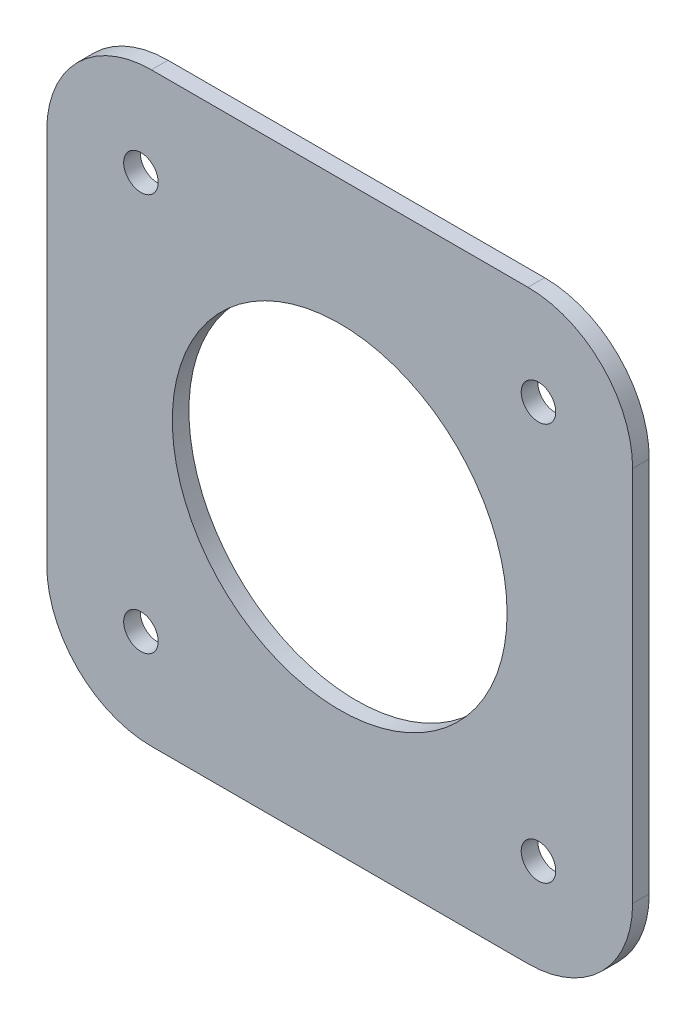
ISO-10303-21;
HEADER;
FILE_DESCRIPTION(('STEP AP214'),'2;1');
FILE_NAME('part.step','',(''),(''),'','','');
FILE_SCHEMA(('AUTOMOTIVE_DESIGN { 1 0 10303 214 1 1 1 1 }'));
ENDSEC;
DATA;
#1=APPLICATION_CONTEXT('core data for automotive mechanical design processes');
#2=APPLICATION_PROTOCOL_DEFINITION('international standard','automotive_design',2000,#1);
#3=PRODUCT_CONTEXT('',#1,'mechanical');
#4=PRODUCT('Part','Part','',(#3));
#5=PRODUCT_RELATED_PRODUCT_CATEGORY('part','',(#4));
#6=PRODUCT_DEFINITION_FORMATION('','',#4);
#7=PRODUCT_DEFINITION_CONTEXT('part definition',#1,'design');
#8=PRODUCT_DEFINITION('design','',#6,#7);
#9=PRODUCT_DEFINITION_SHAPE('','',#8);
#10=(LENGTH_UNIT() NAMED_UNIT(*) SI_UNIT(.MILLI.,.METRE.));
#11=(NAMED_UNIT(*) PLANE_ANGLE_UNIT() SI_UNIT($,.RADIAN.));
#12=(NAMED_UNIT(*) SI_UNIT($,.STERADIAN.) SOLID_ANGLE_UNIT());
#13=UNCERTAINTY_MEASURE_WITH_UNIT(LENGTH_MEASURE(1.E-05),#10,'distance_accuracy_value','');
#14=(GEOMETRIC_REPRESENTATION_CONTEXT(3) GLOBAL_UNCERTAINTY_ASSIGNED_CONTEXT((#13)) GLOBAL_UNIT_ASSIGNED_CONTEXT((#10,
#11,#12)) REPRESENTATION_CONTEXT('',''));
#15=CARTESIAN_POINT('',(0.,0.,0.));
#16=DIRECTION('',(0.,0.,1.));
#17=DIRECTION('',(1.,0.,0.));
#18=AXIS2_PLACEMENT_3D('',#15,#16,#17);
#19=CARTESIAN_POINT('',(449.003152388511,409.510927831157,-572.35));
#20=DIRECTION('',(0.,0.,1.));
#21=DIRECTION('',(1.,0.,0.));
#22=AXIS2_PLACEMENT_3D('',#19,#20,#21);
#23=PLANE('',#22);
#24=CARTESIAN_POINT('',(494.510652388511,427.510927831157,-572.35));
#25=DIRECTION('',(0.,0.,1.));
#26=DIRECTION('',(1.,0.,0.));
#27=AXIS2_PLACEMENT_3D('',#24,#25,#26);
#28=CIRCLE('',#27,10.);
#29=CARTESIAN_POINT('',(504.510652388511,427.510927831157,-572.35));
#30=VERTEX_POINT('',#29);
#31=CARTESIAN_POINT('',(494.510652388511,437.510927831157,-572.35));
#32=VERTEX_POINT('',#31);
#33=EDGE_CURVE('E122',#30,#32,#28,.T.);
#34=ORIENTED_EDGE('',*,*,#33,.F.);
#35=DIRECTION('',(0.,1.,0.));
#36=VECTOR('',#35,1.);
#37=CARTESIAN_POINT('',(504.510652388511,438.510927831157,-572.35));
#38=LINE('',#37,#36);
#39=CARTESIAN_POINT('',(504.510652388511,391.510927831157,-572.35));
#40=VERTEX_POINT('',#39);
#41=EDGE_CURVE('E126',#40,#30,#38,.T.);
#42=ORIENTED_EDGE('',*,*,#41,.F.);
#43=CARTESIAN_POINT('',(494.510652388511,391.510927831157,-572.35));
#44=DIRECTION('',(0.,0.,1.));
#45=DIRECTION('',(1.,0.,0.));
#46=AXIS2_PLACEMENT_3D('',#43,#44,#45);
#47=CIRCLE('',#46,10.);
#48=CARTESIAN_POINT('',(494.510652388511,381.510927831157,-572.35));
#49=VERTEX_POINT('',#48);
#50=EDGE_CURVE('E99',#49,#40,#47,.T.);
#51=ORIENTED_EDGE('',*,*,#50,.F.);
#52=DIRECTION('',(1.,0.,0.));
#53=VECTOR('',#52,1.);
#54=CARTESIAN_POINT('',(512.510652388511,381.510927831157,-572.35));
#55=LINE('',#54,#53);
#56=CARTESIAN_POINT('',(458.510652388511,381.510927831157,-572.35));
#57=VERTEX_POINT('',#56);
#58=EDGE_CURVE('E95',#57,#49,#55,.T.);
#59=ORIENTED_EDGE('',*,*,#58,.F.);
#60=CARTESIAN_POINT('',(458.510652388511,391.510927831157,-572.35));
#61=DIRECTION('',(0.,0.,1.));
#62=DIRECTION('',(1.,0.,0.));
#63=AXIS2_PLACEMENT_3D('',#60,#61,#62);
#64=CIRCLE('',#63,10.);
#65=CARTESIAN_POINT('',(448.510652388511,391.510927831157,-572.35));
#66=VERTEX_POINT('',#65);
#67=EDGE_CURVE('E83',#66,#57,#64,.T.);
#68=ORIENTED_EDGE('',*,*,#67,.F.);
#69=DIRECTION('',(0.,1.,0.));
#70=VECTOR('',#69,1.);
#71=CARTESIAN_POINT('',(448.510652388511,380.510927831157,-572.35));
#72=LINE('',#71,#70);
#73=CARTESIAN_POINT('',(448.510652388511,427.510927831157,-572.35));
#74=VERTEX_POINT('',#73);
#75=EDGE_CURVE('E78',#74,#66,#72,.F.);
#76=ORIENTED_EDGE('',*,*,#75,.F.);
#77=CARTESIAN_POINT('',(458.510652388511,427.510927831157,-572.35));
#78=DIRECTION('',(0.,0.,-1.));
#79=DIRECTION('',(-1.,0.,0.));
#80=AXIS2_PLACEMENT_3D('',#77,#78,#79);
#81=CIRCLE('',#80,10.);
#82=CARTESIAN_POINT('',(458.510652388511,437.510927831157,-572.35));
#83=VERTEX_POINT('',#82);
#84=EDGE_CURVE('E164',#83,#74,#81,.F.);
#85=ORIENTED_EDGE('',*,*,#84,.F.);
#86=DIRECTION('',(1.,0.,0.));
#87=VECTOR('',#86,1.);
#88=CARTESIAN_POINT('',(440.510652388511,437.510927831157,-572.35));
#89=LINE('',#88,#87);
#90=EDGE_CURVE('E118',#32,#83,#89,.F.);
#91=ORIENTED_EDGE('',*,*,#90,.F.);
#92=EDGE_LOOP('',(#34,#42,#51,#59,#68,#76,#85,#91));
#93=FACE_BOUND('',#92,.T.);
#94=CARTESIAN_POINT('',(457.510652388511,428.510927831157,-572.35));
#95=DIRECTION('',(0.,0.,1.));
#96=DIRECTION('',(1.,0.,0.));
#97=AXIS2_PLACEMENT_3D('',#94,#95,#96);
#98=CIRCLE('',#97,1.65);
#99=CARTESIAN_POINT('',(459.160652388511,428.510927831157,-572.35));
#100=VERTEX_POINT('',#99);
#101=EDGE_CURVE('E125',#100,#100,#98,.T.);
#102=ORIENTED_EDGE('',*,*,#101,.T.);
#103=EDGE_LOOP('',(#102));
#104=FACE_BOUND('',#103,.T.);
#105=CARTESIAN_POINT('',(457.510652388511,390.510927831157,-572.35));
#106=DIRECTION('',(0.,0.,1.));
#107=DIRECTION('',(1.,0.,0.));
#108=AXIS2_PLACEMENT_3D('',#105,#106,#107);
#109=CIRCLE('',#108,1.65);
#110=CARTESIAN_POINT('',(459.160652388511,390.510927831157,-572.35));
#111=VERTEX_POINT('',#110);
#112=EDGE_CURVE('E176',#111,#111,#109,.T.);
#113=ORIENTED_EDGE('',*,*,#112,.T.);
#114=EDGE_LOOP('',(#113));
#115=FACE_BOUND('',#114,.T.);
#116=CARTESIAN_POINT('',(495.510652388511,390.510927831157,-572.35));
#117=DIRECTION('',(0.,0.,1.));
#118=DIRECTION('',(1.,0.,0.));
#119=AXIS2_PLACEMENT_3D('',#116,#117,#118);
#120=CIRCLE('',#119,1.65);
#121=CARTESIAN_POINT('',(497.160652388511,390.510927831157,-572.35));
#122=VERTEX_POINT('',#121);
#123=EDGE_CURVE('E180',#122,#122,#120,.T.);
#124=ORIENTED_EDGE('',*,*,#123,.T.);
#125=EDGE_LOOP('',(#124));
#126=FACE_BOUND('',#125,.T.);
#127=CARTESIAN_POINT('',(495.510652388511,428.510927831157,-572.35));
#128=DIRECTION('',(0.,0.,1.));
#129=DIRECTION('',(1.,0.,0.));
#130=AXIS2_PLACEMENT_3D('',#127,#128,#129);
#131=CIRCLE('',#130,1.65);
#132=CARTESIAN_POINT('',(497.160652388511,428.510927831157,-572.35));
#133=VERTEX_POINT('',#132);
#134=EDGE_CURVE('E183',#133,#133,#131,.T.);
#135=ORIENTED_EDGE('',*,*,#134,.T.);
#136=EDGE_LOOP('',(#135));
#137=FACE_BOUND('',#136,.T.);
#138=CARTESIAN_POINT('',(476.510652388511,409.510927831157,-572.35));
#139=DIRECTION('',(0.,0.,1.));
#140=DIRECTION('',(1.,0.,0.));
#141=AXIS2_PLACEMENT_3D('',#138,#139,#140);
#142=CIRCLE('',#141,16.);
#143=CARTESIAN_POINT('',(492.510652388511,409.510927831157,-572.35));
#144=VERTEX_POINT('',#143);
#145=EDGE_CURVE('E19',#144,#144,#142,.T.);
#146=ORIENTED_EDGE('',*,*,#145,.T.);
#147=EDGE_LOOP('',(#146));
#148=FACE_BOUND('',#147,.T.);
#149=ADVANCED_FACE('F16',(#93,#104,#115,#126,#137,#148),#23,.F.);
#150=CARTESIAN_POINT('',(476.510652388511,409.510927831157,-572.35));
#151=DIRECTION('',(0.,0.,1.));
#152=DIRECTION('',(1.,0.,0.));
#153=AXIS2_PLACEMENT_3D('',#150,#151,#152);
#154=CYLINDRICAL_SURFACE('',#153,16.);
#155=CARTESIAN_POINT('',(476.510652388511,409.510927831157,-570.7625));
#156=DIRECTION('',(0.,0.,1.));
#157=DIRECTION('',(1.,0.,0.));
#158=AXIS2_PLACEMENT_3D('',#155,#156,#157);
#159=CIRCLE('',#158,16.);
#160=CARTESIAN_POINT('',(492.510652388511,409.510927831157,-570.7625));
#161=VERTEX_POINT('',#160);
#162=EDGE_CURVE('E160',#161,#161,#159,.F.);
#163=ORIENTED_EDGE('',*,*,#162,.F.);
#164=EDGE_LOOP('',(#163));
#165=FACE_BOUND('',#164,.T.);
#166=ORIENTED_EDGE('',*,*,#145,.F.);
#167=EDGE_LOOP('',(#166));
#168=FACE_BOUND('',#167,.T.);
#169=ADVANCED_FACE('F193',(#165,#168),#154,.F.);
#170=CARTESIAN_POINT('',(495.510652388511,428.510927831157,-572.35));
#171=DIRECTION('',(0.,0.,1.));
#172=DIRECTION('',(1.,0.,0.));
#173=AXIS2_PLACEMENT_3D('',#170,#171,#172);
#174=CYLINDRICAL_SURFACE('',#173,1.65);
#175=CARTESIAN_POINT('',(495.510652388511,428.510927831157,-570.7625));
#176=DIRECTION('',(0.,0.,1.));
#177=DIRECTION('',(1.,0.,0.));
#178=AXIS2_PLACEMENT_3D('',#175,#176,#177);
#179=CIRCLE('',#178,1.65);
#180=CARTESIAN_POINT('',(497.160652388511,428.510927831157,-570.7625));
#181=VERTEX_POINT('',#180);
#182=EDGE_CURVE('E156',#181,#181,#179,.F.);
#183=ORIENTED_EDGE('',*,*,#182,.F.);
#184=EDGE_LOOP('',(#183));
#185=FACE_BOUND('',#184,.T.);
#186=ORIENTED_EDGE('',*,*,#134,.F.);
#187=EDGE_LOOP('',(#186));
#188=FACE_BOUND('',#187,.T.);
#189=ADVANCED_FACE('F195',(#185,#188),#174,.F.);
#190=CARTESIAN_POINT('',(495.510652388511,390.510927831157,-572.35));
#191=DIRECTION('',(0.,0.,1.));
#192=DIRECTION('',(1.,0.,0.));
#193=AXIS2_PLACEMENT_3D('',#190,#191,#192);
#194=CYLINDRICAL_SURFACE('',#193,1.65);
#195=CARTESIAN_POINT('',(495.510652388511,390.510927831157,-570.7625));
#196=DIRECTION('',(0.,0.,1.));
#197=DIRECTION('',(1.,0.,0.));
#198=AXIS2_PLACEMENT_3D('',#195,#196,#197);
#199=CIRCLE('',#198,1.65);
#200=CARTESIAN_POINT('',(497.160652388511,390.510927831157,-570.7625));
#201=VERTEX_POINT('',#200);
#202=EDGE_CURVE('E152',#201,#201,#199,.F.);
#203=ORIENTED_EDGE('',*,*,#202,.F.);
#204=EDGE_LOOP('',(#203));
#205=FACE_BOUND('',#204,.T.);
#206=ORIENTED_EDGE('',*,*,#123,.F.);
#207=EDGE_LOOP('',(#206));
#208=FACE_BOUND('',#207,.T.);
#209=ADVANCED_FACE('F201',(#205,#208),#194,.F.);
#210=CARTESIAN_POINT('',(457.510652388511,390.510927831157,-572.35));
#211=DIRECTION('',(0.,0.,1.));
#212=DIRECTION('',(1.,0.,0.));
#213=AXIS2_PLACEMENT_3D('',#210,#211,#212);
#214=CYLINDRICAL_SURFACE('',#213,1.65);
#215=CARTESIAN_POINT('',(457.510652388511,390.510927831157,-570.7625));
#216=DIRECTION('',(0.,0.,1.));
#217=DIRECTION('',(1.,0.,0.));
#218=AXIS2_PLACEMENT_3D('',#215,#216,#217);
#219=CIRCLE('',#218,1.65);
#220=CARTESIAN_POINT('',(459.160652388511,390.510927831157,-570.7625));
#221=VERTEX_POINT('',#220);
#222=EDGE_CURVE('E148',#221,#221,#219,.F.);
#223=ORIENTED_EDGE('',*,*,#222,.F.);
#224=EDGE_LOOP('',(#223));
#225=FACE_BOUND('',#224,.T.);
#226=ORIENTED_EDGE('',*,*,#112,.F.);
#227=EDGE_LOOP('',(#226));
#228=FACE_BOUND('',#227,.T.);
#229=ADVANCED_FACE('F242',(#225,#228),#214,.F.);
#230=CARTESIAN_POINT('',(457.510652388511,428.510927831157,-572.35));
#231=DIRECTION('',(0.,0.,1.));
#232=DIRECTION('',(1.,0.,0.));
#233=AXIS2_PLACEMENT_3D('',#230,#231,#232);
#234=CYLINDRICAL_SURFACE('',#233,1.65);
#235=CARTESIAN_POINT('',(457.510652388511,428.510927831157,-570.7625));
#236=DIRECTION('',(0.,0.,1.));
#237=DIRECTION('',(1.,0.,0.));
#238=AXIS2_PLACEMENT_3D('',#235,#236,#237);
#239=CIRCLE('',#238,1.65);
#240=CARTESIAN_POINT('',(459.160652388511,428.510927831157,-570.7625));
#241=VERTEX_POINT('',#240);
#242=EDGE_CURVE('E144',#241,#241,#239,.F.);
#243=ORIENTED_EDGE('',*,*,#242,.F.);
#244=EDGE_LOOP('',(#243));
#245=FACE_BOUND('',#244,.T.);
#246=ORIENTED_EDGE('',*,*,#101,.F.);
#247=EDGE_LOOP('',(#246));
#248=FACE_BOUND('',#247,.T.);
#249=ADVANCED_FACE('F239',(#245,#248),#234,.F.);
#250=CARTESIAN_POINT('',(448.510652388511,380.510927831157,-572.35));
#251=DIRECTION('',(-1.,0.,0.));
#252=DIRECTION('',(0.,0.,1.));
#253=AXIS2_PLACEMENT_3D('',#250,#251,#252);
#254=PLANE('',#253);
#255=DIRECTION('',(0.,0.,1.));
#256=VECTOR('',#255,1.);
#257=CARTESIAN_POINT('',(448.510652388511,391.510927831157,-572.35));
#258=LINE('',#257,#256);
#259=CARTESIAN_POINT('',(448.510652388511,391.510927831157,-570.7625));
#260=VERTEX_POINT('',#259);
#261=EDGE_CURVE('E90',#260,#66,#258,.F.);
#262=ORIENTED_EDGE('',*,*,#261,.F.);
#263=DIRECTION('',(0.,1.,0.));
#264=VECTOR('',#263,1.);
#265=CARTESIAN_POINT('',(448.510652388511,409.510927831157,-570.7625));
#266=LINE('',#265,#264);
#267=CARTESIAN_POINT('',(448.510652388511,427.510927831157,-570.7625));
#268=VERTEX_POINT('',#267);
#269=EDGE_CURVE('E143',#268,#260,#266,.F.);
#270=ORIENTED_EDGE('',*,*,#269,.F.);
#271=DIRECTION('',(0.,0.,-1.));
#272=VECTOR('',#271,1.);
#273=CARTESIAN_POINT('',(448.510652388511,427.510927831157,-572.35));
#274=LINE('',#273,#272);
#275=EDGE_CURVE('E386',#74,#268,#274,.F.);
#276=ORIENTED_EDGE('',*,*,#275,.F.);
#277=ORIENTED_EDGE('',*,*,#75,.T.);
#278=EDGE_LOOP('',(#262,#270,#276,#277));
#279=FACE_BOUND('',#278,.T.);
#280=ADVANCED_FACE('F236',(#279),#254,.T.);
#281=CARTESIAN_POINT('',(458.510652388511,391.510927831157,-572.35));
#282=DIRECTION('',(0.,0.,1.));
#283=DIRECTION('',(1.,0.,0.));
#284=AXIS2_PLACEMENT_3D('',#281,#282,#283);
#285=CYLINDRICAL_SURFACE('',#284,10.);
#286=DIRECTION('',(0.,0.,-1.));
#287=VECTOR('',#286,1.);
#288=CARTESIAN_POINT('',(458.510652388511,381.510927831157,-572.35));
#289=LINE('',#288,#287);
#290=CARTESIAN_POINT('',(458.510652388511,381.510927831157,-570.7625));
#291=VERTEX_POINT('',#290);
#292=EDGE_CURVE('E88',#291,#57,#289,.T.);
#293=ORIENTED_EDGE('',*,*,#292,.F.);
#294=CARTESIAN_POINT('',(458.510652388511,391.510927831157,-570.7625));
#295=DIRECTION('',(0.,0.,1.));
#296=DIRECTION('',(1.,0.,0.));
#297=AXIS2_PLACEMENT_3D('',#294,#295,#296);
#298=CIRCLE('',#297,10.);
#299=EDGE_CURVE('E140',#260,#291,#298,.T.);
#300=ORIENTED_EDGE('',*,*,#299,.F.);
#301=ORIENTED_EDGE('',*,*,#261,.T.);
#302=ORIENTED_EDGE('',*,*,#67,.T.);
#303=EDGE_LOOP('',(#293,#300,#301,#302));
#304=FACE_BOUND('',#303,.T.);
#305=ADVANCED_FACE('F85',(#304),#285,.T.);
#306=CARTESIAN_POINT('',(512.510652388511,381.510927831157,-572.35));
#307=DIRECTION('',(0.,-1.,0.));
#308=DIRECTION('',(0.,0.,-1.));
#309=AXIS2_PLACEMENT_3D('',#306,#307,#308);
#310=PLANE('',#309);
#311=ORIENTED_EDGE('',*,*,#292,.T.);
#312=ORIENTED_EDGE('',*,*,#58,.T.);
#313=DIRECTION('',(0.,0.,1.));
#314=VECTOR('',#313,1.);
#315=CARTESIAN_POINT('',(494.510652388511,381.510927831157,-572.35));
#316=LINE('',#315,#314);
#317=CARTESIAN_POINT('',(494.510652388511,381.510927831157,-570.7625));
#318=VERTEX_POINT('',#317);
#319=EDGE_CURVE('E103',#318,#49,#316,.F.);
#320=ORIENTED_EDGE('',*,*,#319,.F.);
#321=DIRECTION('',(1.,0.,0.));
#322=VECTOR('',#321,1.);
#323=CARTESIAN_POINT('',(449.003152388511,381.510927831157,-570.7625));
#324=LINE('',#323,#322);
#325=EDGE_CURVE('E107',#291,#318,#324,.T.);
#326=ORIENTED_EDGE('',*,*,#325,.F.);
#327=EDGE_LOOP('',(#311,#312,#320,#326));
#328=FACE_BOUND('',#327,.T.);
#329=ADVANCED_FACE('F105',(#328),#310,.T.);
#330=CARTESIAN_POINT('',(494.510652388511,391.510927831157,-572.35));
#331=DIRECTION('',(0.,0.,1.));
#332=DIRECTION('',(1.,0.,0.));
#333=AXIS2_PLACEMENT_3D('',#330,#331,#332);
#334=CYLINDRICAL_SURFACE('',#333,10.);
#335=DIRECTION('',(0.,0.,-1.));
#336=VECTOR('',#335,1.);
#337=CARTESIAN_POINT('',(504.510652388511,391.510927831157,-572.35));
#338=LINE('',#337,#336);
#339=CARTESIAN_POINT('',(504.510652388511,391.510927831157,-570.7625));
#340=VERTEX_POINT('',#339);
#341=EDGE_CURVE('E129',#340,#40,#338,.T.);
#342=ORIENTED_EDGE('',*,*,#341,.F.);
#343=CARTESIAN_POINT('',(494.510652388511,391.510927831157,-570.7625));
#344=DIRECTION('',(0.,0.,1.));
#345=DIRECTION('',(1.,0.,0.));
#346=AXIS2_PLACEMENT_3D('',#343,#344,#345);
#347=CIRCLE('',#346,10.);
#348=EDGE_CURVE('E136',#318,#340,#347,.T.);
#349=ORIENTED_EDGE('',*,*,#348,.F.);
#350=ORIENTED_EDGE('',*,*,#319,.T.);
#351=ORIENTED_EDGE('',*,*,#50,.T.);
#352=EDGE_LOOP('',(#342,#349,#350,#351));
#353=FACE_BOUND('',#352,.T.);
#354=ADVANCED_FACE('F227',(#353),#334,.T.);
#355=CARTESIAN_POINT('',(504.510652388511,438.510927831157,-572.35));
#356=DIRECTION('',(1.,0.,0.));
#357=DIRECTION('',(0.,0.,-1.));
#358=AXIS2_PLACEMENT_3D('',#355,#356,#357);
#359=PLANE('',#358);
#360=ORIENTED_EDGE('',*,*,#341,.T.);
#361=ORIENTED_EDGE('',*,*,#41,.T.);
#362=DIRECTION('',(0.,0.,1.));
#363=VECTOR('',#362,1.);
#364=CARTESIAN_POINT('',(504.510652388511,427.510927831157,-572.35));
#365=LINE('',#364,#363);
#366=CARTESIAN_POINT('',(504.510652388511,427.510927831157,-570.7625));
#367=VERTEX_POINT('',#366);
#368=EDGE_CURVE('E128',#367,#30,#365,.F.);
#369=ORIENTED_EDGE('',*,*,#368,.F.);
#370=DIRECTION('',(0.,1.,0.));
#371=VECTOR('',#370,1.);
#372=CARTESIAN_POINT('',(504.510652388511,409.510927831157,-570.7625));
#373=LINE('',#372,#371);
#374=EDGE_CURVE('E135',#340,#367,#373,.T.);
#375=ORIENTED_EDGE('',*,*,#374,.F.);
#376=EDGE_LOOP('',(#360,#361,#369,#375));
#377=FACE_BOUND('',#376,.T.);
#378=ADVANCED_FACE('F223',(#377),#359,.T.);
#379=CARTESIAN_POINT('',(494.510652388511,427.510927831157,-572.35));
#380=DIRECTION('',(0.,0.,1.));
#381=DIRECTION('',(1.,0.,0.));
#382=AXIS2_PLACEMENT_3D('',#379,#380,#381);
#383=CYLINDRICAL_SURFACE('',#382,10.);
#384=DIRECTION('',(0.,0.,1.));
#385=VECTOR('',#384,1.);
#386=CARTESIAN_POINT('',(494.510652388511,437.510927831157,-572.35));
#387=LINE('',#386,#385);
#388=CARTESIAN_POINT('',(494.510652388511,437.510927831157,-570.7625));
#389=VERTEX_POINT('',#388);
#390=EDGE_CURVE('E121',#389,#32,#387,.F.);
#391=ORIENTED_EDGE('',*,*,#390,.F.);
#392=CARTESIAN_POINT('',(494.510652388511,427.510927831157,-570.7625));
#393=DIRECTION('',(0.,0.,1.));
#394=DIRECTION('',(1.,0.,0.));
#395=AXIS2_PLACEMENT_3D('',#392,#393,#394);
#396=CIRCLE('',#395,10.);
#397=EDGE_CURVE('E131',#367,#389,#396,.T.);
#398=ORIENTED_EDGE('',*,*,#397,.F.);
#399=ORIENTED_EDGE('',*,*,#368,.T.);
#400=ORIENTED_EDGE('',*,*,#33,.T.);
#401=EDGE_LOOP('',(#391,#398,#399,#400));
#402=FACE_BOUND('',#401,.T.);
#403=ADVANCED_FACE('F220',(#402),#383,.T.);
#404=CARTESIAN_POINT('',(440.510652388511,437.510927831157,-572.35));
#405=DIRECTION('',(0.,1.,0.));
#406=DIRECTION('',(0.,0.,1.));
#407=AXIS2_PLACEMENT_3D('',#404,#405,#406);
#408=PLANE('',#407);
#409=DIRECTION('',(1.,0.,0.));
#410=VECTOR('',#409,1.);
#411=CARTESIAN_POINT('',(449.003152388511,437.510927831157,-570.7625));
#412=LINE('',#411,#410);
#413=CARTESIAN_POINT('',(458.510652388511,437.510927831157,-570.7625));
#414=VERTEX_POINT('',#413);
#415=EDGE_CURVE('E26',#389,#414,#412,.F.);
#416=ORIENTED_EDGE('',*,*,#415,.F.);
#417=ORIENTED_EDGE('',*,*,#390,.T.);
#418=ORIENTED_EDGE('',*,*,#90,.T.);
#419=DIRECTION('',(0.,0.,-1.));
#420=VECTOR('',#419,1.);
#421=CARTESIAN_POINT('',(458.510652388511,437.510927831157,-572.35));
#422=LINE('',#421,#420);
#423=EDGE_CURVE('E35',#414,#83,#422,.T.);
#424=ORIENTED_EDGE('',*,*,#423,.F.);
#425=EDGE_LOOP('',(#416,#417,#418,#424));
#426=FACE_BOUND('',#425,.T.);
#427=ADVANCED_FACE('F212',(#426),#408,.T.);
#428=CARTESIAN_POINT('',(458.510652388511,427.510927831157,-572.35));
#429=DIRECTION('',(0.,0.,-1.));
#430=DIRECTION('',(-1.,0.,0.));
#431=AXIS2_PLACEMENT_3D('',#428,#429,#430);
#432=CYLINDRICAL_SURFACE('',#431,10.);
#433=ORIENTED_EDGE('',*,*,#423,.T.);
#434=ORIENTED_EDGE('',*,*,#84,.T.);
#435=ORIENTED_EDGE('',*,*,#275,.T.);
#436=CARTESIAN_POINT('',(458.510652388511,427.510927831157,-570.7625));
#437=DIRECTION('',(0.,0.,-1.));
#438=DIRECTION('',(-1.,0.,0.));
#439=AXIS2_PLACEMENT_3D('',#436,#437,#438);
#440=CIRCLE('',#439,10.);
#441=EDGE_CURVE('E11',#414,#268,#440,.F.);
#442=ORIENTED_EDGE('',*,*,#441,.F.);
#443=EDGE_LOOP('',(#433,#434,#435,#442));
#444=FACE_BOUND('',#443,.T.);
#445=ADVANCED_FACE('F207',(#444),#432,.T.);
#446=CARTESIAN_POINT('',(449.003152388511,409.510927831157,-570.7625));
#447=DIRECTION('',(0.,0.,1.));
#448=DIRECTION('',(1.,0.,0.));
#449=AXIS2_PLACEMENT_3D('',#446,#447,#448);
#450=PLANE('',#449);
#451=ORIENTED_EDGE('',*,*,#415,.T.);
#452=ORIENTED_EDGE('',*,*,#441,.T.);
#453=ORIENTED_EDGE('',*,*,#269,.T.);
#454=ORIENTED_EDGE('',*,*,#299,.T.);
#455=ORIENTED_EDGE('',*,*,#325,.T.);
#456=ORIENTED_EDGE('',*,*,#348,.T.);
#457=ORIENTED_EDGE('',*,*,#374,.T.);
#458=ORIENTED_EDGE('',*,*,#397,.T.);
#459=EDGE_LOOP('',(#451,#452,#453,#454,#455,#456,#457,#458));
#460=FACE_BOUND('',#459,.T.);
#461=ORIENTED_EDGE('',*,*,#242,.T.);
#462=EDGE_LOOP('',(#461));
#463=FACE_BOUND('',#462,.T.);
#464=ORIENTED_EDGE('',*,*,#222,.T.);
#465=EDGE_LOOP('',(#464));
#466=FACE_BOUND('',#465,.T.);
#467=ORIENTED_EDGE('',*,*,#202,.T.);
#468=EDGE_LOOP('',(#467));
#469=FACE_BOUND('',#468,.T.);
#470=ORIENTED_EDGE('',*,*,#182,.T.);
#471=EDGE_LOOP('',(#470));
#472=FACE_BOUND('',#471,.T.);
#473=ORIENTED_EDGE('',*,*,#162,.T.);
#474=EDGE_LOOP('',(#473));
#475=FACE_BOUND('',#474,.T.);
#476=ADVANCED_FACE('F205',(#460,#463,#466,#469,#472,#475),#450,.T.);
#477=CLOSED_SHELL('',(#149,#169,#189,#209,#229,#249,#280,#305,#329,#354,#378,#403,#427,#445,#476));
#478=MANIFOLD_SOLID_BREP('B1',#477);
#479=ADVANCED_BREP_SHAPE_REPRESENTATION('',(#18,#478),#14);
#480=SHAPE_DEFINITION_REPRESENTATION(#9,#479);
ENDSEC;
END-ISO-10303-21;
